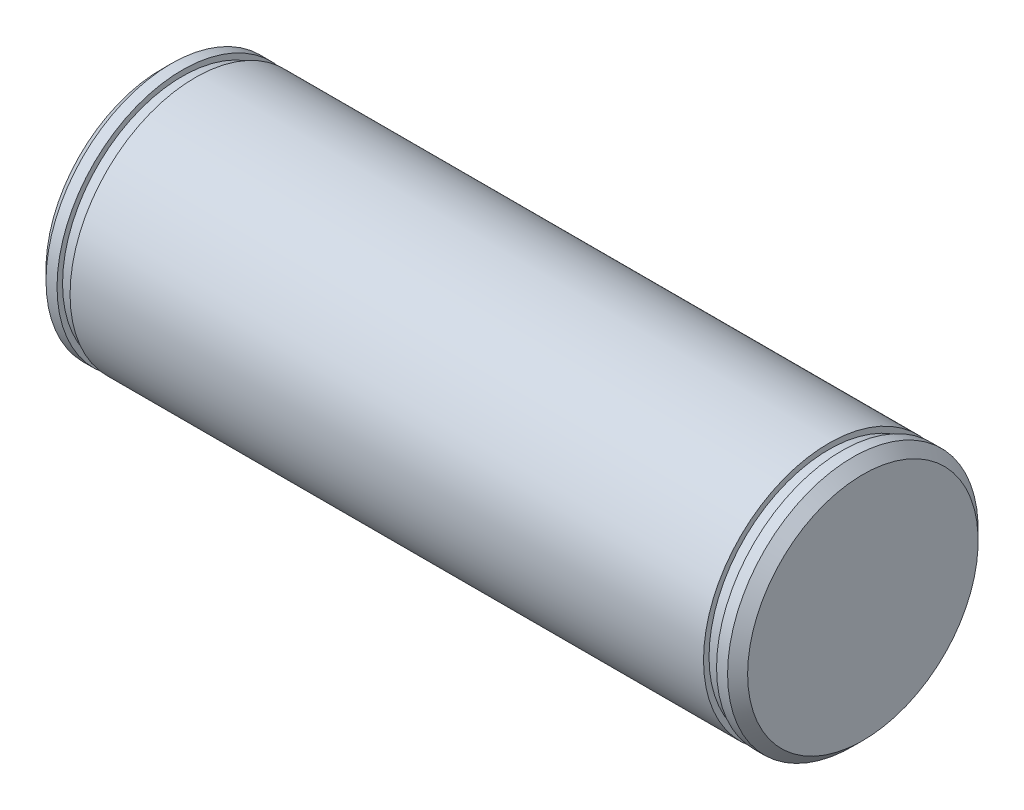
ISO-10303-21;
HEADER;
FILE_DESCRIPTION(('STEP AP214'),'2;1');
FILE_NAME('part.step','',(''),(''),'','','');
FILE_SCHEMA(('AUTOMOTIVE_DESIGN { 1 0 10303 214 1 1 1 1 }'));
ENDSEC;
DATA;
#1=APPLICATION_CONTEXT('core data for automotive mechanical design processes');
#2=APPLICATION_PROTOCOL_DEFINITION('international standard','automotive_design',2000,#1);
#3=PRODUCT_CONTEXT('',#1,'mechanical');
#4=PRODUCT('Part','Part','',(#3));
#5=PRODUCT_RELATED_PRODUCT_CATEGORY('part','',(#4));
#6=PRODUCT_DEFINITION_FORMATION('','',#4);
#7=PRODUCT_DEFINITION_CONTEXT('part definition',#1,'design');
#8=PRODUCT_DEFINITION('design','',#6,#7);
#9=PRODUCT_DEFINITION_SHAPE('','',#8);
#10=(LENGTH_UNIT() NAMED_UNIT(*) SI_UNIT(.MILLI.,.METRE.));
#11=(NAMED_UNIT(*) PLANE_ANGLE_UNIT() SI_UNIT($,.RADIAN.));
#12=(NAMED_UNIT(*) SI_UNIT($,.STERADIAN.) SOLID_ANGLE_UNIT());
#13=UNCERTAINTY_MEASURE_WITH_UNIT(LENGTH_MEASURE(1.E-05),#10,'distance_accuracy_value','');
#14=(GEOMETRIC_REPRESENTATION_CONTEXT(3) GLOBAL_UNCERTAINTY_ASSIGNED_CONTEXT((#13)) GLOBAL_UNIT_ASSIGNED_CONTEXT((#10,
#11,#12)) REPRESENTATION_CONTEXT('',''));
#15=CARTESIAN_POINT('',(0.,0.,0.));
#16=DIRECTION('',(0.,0.,1.));
#17=DIRECTION('',(1.,0.,0.));
#18=AXIS2_PLACEMENT_3D('',#15,#16,#17);
#19=CARTESIAN_POINT('',(0.,0.,0.));
#20=DIRECTION('',(1.,0.,0.));
#21=DIRECTION('',(0.,0.,-1.));
#22=AXIS2_PLACEMENT_3D('',#19,#20,#21);
#23=PLANE('',#22);
#24=CARTESIAN_POINT('',(0.,0.,0.));
#25=DIRECTION('',(1.,0.,0.));
#26=DIRECTION('',(0.,0.,-1.));
#27=AXIS2_PLACEMENT_3D('',#24,#25,#26);
#28=CIRCLE('',#27,11.5);
#29=CARTESIAN_POINT('',(0.,0.,-11.5));
#30=VERTEX_POINT('',#29);
#31=EDGE_CURVE('E47',#30,#30,#28,.F.);
#32=ORIENTED_EDGE('',*,*,#31,.T.);
#33=EDGE_LOOP('',(#32));
#34=FACE_BOUND('',#33,.T.);
#35=ADVANCED_FACE('F32',(#34),#23,.F.);
#36=CARTESIAN_POINT('',(0.,0.,0.));
#37=DIRECTION('',(-1.,0.,0.));
#38=DIRECTION('',(0.,0.,1.));
#39=AXIS2_PLACEMENT_3D('',#36,#37,#38);
#40=CYLINDRICAL_SURFACE('',#39,12.5);
#41=CARTESIAN_POINT('',(0.999999999999992,0.,0.));
#42=DIRECTION('',(1.,0.,0.));
#43=DIRECTION('',(0.,0.,-1.));
#44=AXIS2_PLACEMENT_3D('',#41,#42,#43);
#45=CIRCLE('',#44,12.5);
#46=CARTESIAN_POINT('',(0.999999999999992,0.,-12.5));
#47=VERTEX_POINT('',#46);
#48=EDGE_CURVE('E43',#47,#47,#45,.T.);
#49=ORIENTED_EDGE('',*,*,#48,.T.);
#50=EDGE_LOOP('',(#49));
#51=FACE_BOUND('',#50,.T.);
#52=CARTESIAN_POINT('',(2.1,0.,0.));
#53=DIRECTION('',(-1.,0.,0.));
#54=DIRECTION('',(0.,0.,1.));
#55=AXIS2_PLACEMENT_3D('',#52,#53,#54);
#56=CIRCLE('',#55,12.5);
#57=CARTESIAN_POINT('',(2.1,0.,12.5));
#58=VERTEX_POINT('',#57);
#59=EDGE_CURVE('E52',#58,#58,#56,.T.);
#60=ORIENTED_EDGE('',*,*,#59,.T.);
#61=EDGE_LOOP('',(#60));
#62=FACE_BOUND('',#61,.T.);
#63=ADVANCED_FACE('F93',(#51,#62),#40,.T.);
#64=CARTESIAN_POINT('',(2.1,12.5,0.));
#65=DIRECTION('',(-1.,0.,0.));
#66=DIRECTION('',(0.,0.,1.));
#67=AXIS2_PLACEMENT_3D('',#64,#65,#66);
#68=PLANE('',#67);
#69=ORIENTED_EDGE('',*,*,#59,.F.);
#70=EDGE_LOOP('',(#69));
#71=FACE_BOUND('',#70,.T.);
#72=CARTESIAN_POINT('',(2.1,0.,0.));
#73=DIRECTION('',(-1.,0.,0.));
#74=DIRECTION('',(0.,0.,1.));
#75=AXIS2_PLACEMENT_3D('',#72,#73,#74);
#76=CIRCLE('',#75,11.95);
#77=CARTESIAN_POINT('',(2.1,0.,11.95));
#78=VERTEX_POINT('',#77);
#79=EDGE_CURVE('E55',#78,#78,#76,.T.);
#80=ORIENTED_EDGE('',*,*,#79,.T.);
#81=EDGE_LOOP('',(#80));
#82=FACE_BOUND('',#81,.T.);
#83=ADVANCED_FACE('F99',(#71,#82),#68,.F.);
#84=CARTESIAN_POINT('',(0.,0.,0.));
#85=DIRECTION('',(-1.,0.,0.));
#86=DIRECTION('',(0.,0.,1.));
#87=AXIS2_PLACEMENT_3D('',#84,#85,#86);
#88=CYLINDRICAL_SURFACE('',#87,11.95);
#89=ORIENTED_EDGE('',*,*,#79,.F.);
#90=EDGE_LOOP('',(#89));
#91=FACE_BOUND('',#90,.T.);
#92=CARTESIAN_POINT('',(3.4,0.,0.));
#93=DIRECTION('',(-1.,0.,0.));
#94=DIRECTION('',(0.,0.,1.));
#95=AXIS2_PLACEMENT_3D('',#92,#93,#94);
#96=CIRCLE('',#95,11.95);
#97=CARTESIAN_POINT('',(3.4,0.,11.95));
#98=VERTEX_POINT('',#97);
#99=EDGE_CURVE('E58',#98,#98,#96,.T.);
#100=ORIENTED_EDGE('',*,*,#99,.T.);
#101=EDGE_LOOP('',(#100));
#102=FACE_BOUND('',#101,.T.);
#103=ADVANCED_FACE('F117',(#91,#102),#88,.T.);
#104=CARTESIAN_POINT('',(3.4,11.95,0.));
#105=DIRECTION('',(1.,0.,0.));
#106=DIRECTION('',(0.,0.,-1.));
#107=AXIS2_PLACEMENT_3D('',#104,#105,#106);
#108=PLANE('',#107);
#109=ORIENTED_EDGE('',*,*,#99,.F.);
#110=EDGE_LOOP('',(#109));
#111=FACE_BOUND('',#110,.T.);
#112=CARTESIAN_POINT('',(3.4,0.,0.));
#113=DIRECTION('',(-1.,0.,0.));
#114=DIRECTION('',(0.,0.,1.));
#115=AXIS2_PLACEMENT_3D('',#112,#113,#114);
#116=CIRCLE('',#115,12.5);
#117=CARTESIAN_POINT('',(3.4,0.,12.5));
#118=VERTEX_POINT('',#117);
#119=EDGE_CURVE('E61',#118,#118,#116,.T.);
#120=ORIENTED_EDGE('',*,*,#119,.T.);
#121=EDGE_LOOP('',(#120));
#122=FACE_BOUND('',#121,.T.);
#123=ADVANCED_FACE('F122',(#111,#122),#108,.F.);
#124=CARTESIAN_POINT('',(0.,0.,0.));
#125=DIRECTION('',(-1.,0.,0.));
#126=DIRECTION('',(0.,0.,1.));
#127=AXIS2_PLACEMENT_3D('',#124,#125,#126);
#128=CYLINDRICAL_SURFACE('',#127,12.5);
#129=ORIENTED_EDGE('',*,*,#119,.F.);
#130=EDGE_LOOP('',(#129));
#131=FACE_BOUND('',#130,.T.);
#132=CARTESIAN_POINT('',(66.6,0.,0.));
#133=DIRECTION('',(-1.,0.,0.));
#134=DIRECTION('',(0.,0.,1.));
#135=AXIS2_PLACEMENT_3D('',#132,#133,#134);
#136=CIRCLE('',#135,12.5);
#137=CARTESIAN_POINT('',(66.6,0.,12.5));
#138=VERTEX_POINT('',#137);
#139=EDGE_CURVE('E64',#138,#138,#136,.T.);
#140=ORIENTED_EDGE('',*,*,#139,.T.);
#141=EDGE_LOOP('',(#140));
#142=FACE_BOUND('',#141,.T.);
#143=ADVANCED_FACE('F128',(#131,#142),#128,.T.);
#144=CARTESIAN_POINT('',(66.6,12.5,0.));
#145=DIRECTION('',(-1.,0.,0.));
#146=DIRECTION('',(0.,0.,1.));
#147=AXIS2_PLACEMENT_3D('',#144,#145,#146);
#148=PLANE('',#147);
#149=ORIENTED_EDGE('',*,*,#139,.F.);
#150=EDGE_LOOP('',(#149));
#151=FACE_BOUND('',#150,.T.);
#152=CARTESIAN_POINT('',(66.6,0.,0.));
#153=DIRECTION('',(-1.,0.,0.));
#154=DIRECTION('',(0.,0.,1.));
#155=AXIS2_PLACEMENT_3D('',#152,#153,#154);
#156=CIRCLE('',#155,11.95);
#157=CARTESIAN_POINT('',(66.6,0.,11.95));
#158=VERTEX_POINT('',#157);
#159=EDGE_CURVE('E67',#158,#158,#156,.T.);
#160=ORIENTED_EDGE('',*,*,#159,.T.);
#161=EDGE_LOOP('',(#160));
#162=FACE_BOUND('',#161,.T.);
#163=ADVANCED_FACE('F134',(#151,#162),#148,.F.);
#164=CARTESIAN_POINT('',(0.,0.,0.));
#165=DIRECTION('',(-1.,0.,0.));
#166=DIRECTION('',(0.,0.,1.));
#167=AXIS2_PLACEMENT_3D('',#164,#165,#166);
#168=CYLINDRICAL_SURFACE('',#167,11.95);
#169=ORIENTED_EDGE('',*,*,#159,.F.);
#170=EDGE_LOOP('',(#169));
#171=FACE_BOUND('',#170,.T.);
#172=CARTESIAN_POINT('',(67.9,0.,0.));
#173=DIRECTION('',(-1.,0.,0.));
#174=DIRECTION('',(0.,0.,1.));
#175=AXIS2_PLACEMENT_3D('',#172,#173,#174);
#176=CIRCLE('',#175,11.95);
#177=CARTESIAN_POINT('',(67.9,0.,11.95));
#178=VERTEX_POINT('',#177);
#179=EDGE_CURVE('E70',#178,#178,#176,.T.);
#180=ORIENTED_EDGE('',*,*,#179,.T.);
#181=EDGE_LOOP('',(#180));
#182=FACE_BOUND('',#181,.T.);
#183=ADVANCED_FACE('F89',(#171,#182),#168,.T.);
#184=CARTESIAN_POINT('',(67.9,11.95,0.));
#185=DIRECTION('',(1.,0.,0.));
#186=DIRECTION('',(0.,0.,-1.));
#187=AXIS2_PLACEMENT_3D('',#184,#185,#186);
#188=PLANE('',#187);
#189=ORIENTED_EDGE('',*,*,#179,.F.);
#190=EDGE_LOOP('',(#189));
#191=FACE_BOUND('',#190,.T.);
#192=CARTESIAN_POINT('',(67.9,0.,0.));
#193=DIRECTION('',(-1.,0.,0.));
#194=DIRECTION('',(0.,0.,1.));
#195=AXIS2_PLACEMENT_3D('',#192,#193,#194);
#196=CIRCLE('',#195,12.5);
#197=CARTESIAN_POINT('',(67.9,0.,12.5));
#198=VERTEX_POINT('',#197);
#199=EDGE_CURVE('E73',#198,#198,#196,.T.);
#200=ORIENTED_EDGE('',*,*,#199,.T.);
#201=EDGE_LOOP('',(#200));
#202=FACE_BOUND('',#201,.T.);
#203=ADVANCED_FACE('F77',(#191,#202),#188,.F.);
#204=CARTESIAN_POINT('',(0.,0.,0.));
#205=DIRECTION('',(-1.,0.,0.));
#206=DIRECTION('',(0.,0.,1.));
#207=AXIS2_PLACEMENT_3D('',#204,#205,#206);
#208=CYLINDRICAL_SURFACE('',#207,12.5);
#209=CARTESIAN_POINT('',(69.,0.,0.));
#210=DIRECTION('',(-1.,0.,0.));
#211=DIRECTION('',(0.,0.,1.));
#212=AXIS2_PLACEMENT_3D('',#209,#210,#211);
#213=CIRCLE('',#212,12.5);
#214=CARTESIAN_POINT('',(69.,0.,12.5));
#215=VERTEX_POINT('',#214);
#216=EDGE_CURVE('E39',#215,#215,#213,.T.);
#217=ORIENTED_EDGE('',*,*,#216,.T.);
#218=EDGE_LOOP('',(#217));
#219=FACE_BOUND('',#218,.T.);
#220=ORIENTED_EDGE('',*,*,#199,.F.);
#221=EDGE_LOOP('',(#220));
#222=FACE_BOUND('',#221,.T.);
#223=ADVANCED_FACE('F79',(#219,#222),#208,.T.);
#224=CARTESIAN_POINT('',(70.,12.5,0.));
#225=DIRECTION('',(-1.,0.,0.));
#226=DIRECTION('',(0.,0.,1.));
#227=AXIS2_PLACEMENT_3D('',#224,#225,#226);
#228=PLANE('',#227);
#229=CARTESIAN_POINT('',(70.,0.,0.));
#230=DIRECTION('',(-1.,0.,0.));
#231=DIRECTION('',(0.,0.,1.));
#232=AXIS2_PLACEMENT_3D('',#229,#230,#231);
#233=CIRCLE('',#232,11.5);
#234=CARTESIAN_POINT('',(70.,0.,11.5));
#235=VERTEX_POINT('',#234);
#236=EDGE_CURVE('E10',#235,#235,#233,.F.);
#237=ORIENTED_EDGE('',*,*,#236,.T.);
#238=EDGE_LOOP('',(#237));
#239=FACE_BOUND('',#238,.T.);
#240=ADVANCED_FACE('F81',(#239),#228,.F.);
#241=CARTESIAN_POINT('',(0.,0.,0.));
#242=DIRECTION('',(1.,0.,0.));
#243=DIRECTION('',(0.,0.,-1.));
#244=AXIS2_PLACEMENT_3D('',#241,#242,#243);
#245=CONICAL_SURFACE('',#244,11.5,0.78539816339745);
#246=ORIENTED_EDGE('',*,*,#48,.F.);
#247=EDGE_LOOP('',(#246));
#248=FACE_BOUND('',#247,.T.);
#249=ORIENTED_EDGE('',*,*,#31,.F.);
#250=EDGE_LOOP('',(#249));
#251=FACE_BOUND('',#250,.T.);
#252=ADVANCED_FACE('F87',(#248,#251),#245,.T.);
#253=CARTESIAN_POINT('',(69.,0.,0.));
#254=DIRECTION('',(-1.,0.,0.));
#255=DIRECTION('',(0.,0.,1.));
#256=AXIS2_PLACEMENT_3D('',#253,#254,#255);
#257=CONICAL_SURFACE('',#256,12.5,0.785398163397441);
#258=ORIENTED_EDGE('',*,*,#236,.F.);
#259=EDGE_LOOP('',(#258));
#260=FACE_BOUND('',#259,.T.);
#261=ORIENTED_EDGE('',*,*,#216,.F.);
#262=EDGE_LOOP('',(#261));
#263=FACE_BOUND('',#262,.T.);
#264=ADVANCED_FACE('F34',(#260,#263),#257,.T.);
#265=CLOSED_SHELL('',(#35,#63,#83,#103,#123,#143,#163,#183,#203,#223,#240,#252,#264));
#266=MANIFOLD_SOLID_BREP('B2',#265);
#267=ADVANCED_BREP_SHAPE_REPRESENTATION('',(#18,#266),#14);
#268=SHAPE_DEFINITION_REPRESENTATION(#9,#267);
ENDSEC;
END-ISO-10303-21;
